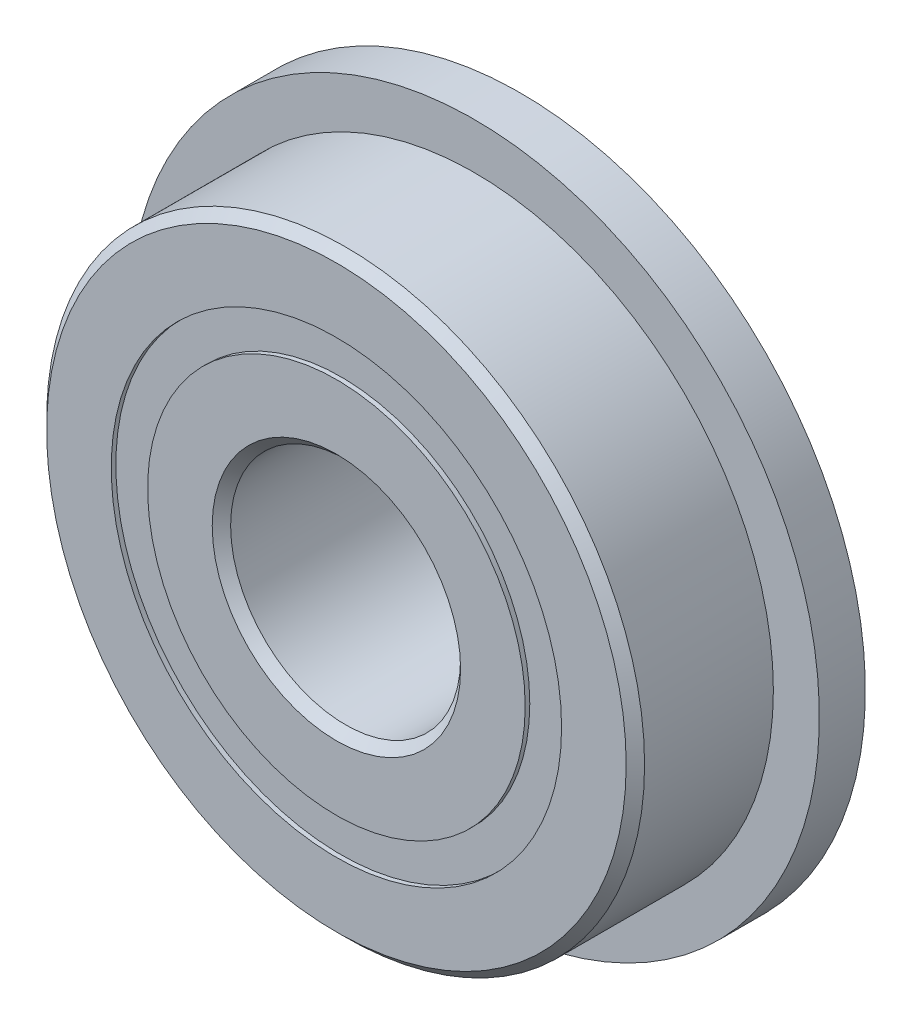
ISO-10303-21;
HEADER;
FILE_DESCRIPTION(('STEP AP214'),'2;1');
FILE_NAME('part.step','',(''),(''),'','','');
FILE_SCHEMA(('AUTOMOTIVE_DESIGN { 1 0 10303 214 1 1 1 1 }'));
ENDSEC;
DATA;
#1=APPLICATION_CONTEXT('core data for automotive mechanical design processes');
#2=APPLICATION_PROTOCOL_DEFINITION('international standard','automotive_design',2000,#1);
#3=PRODUCT_CONTEXT('',#1,'mechanical');
#4=PRODUCT('Part','Part','',(#3));
#5=PRODUCT_RELATED_PRODUCT_CATEGORY('part','',(#4));
#6=PRODUCT_DEFINITION_FORMATION('','',#4);
#7=PRODUCT_DEFINITION_CONTEXT('part definition',#1,'design');
#8=PRODUCT_DEFINITION('design','',#6,#7);
#9=PRODUCT_DEFINITION_SHAPE('','',#8);
#10=(LENGTH_UNIT() NAMED_UNIT(*) SI_UNIT(.MILLI.,.METRE.));
#11=(NAMED_UNIT(*) PLANE_ANGLE_UNIT() SI_UNIT($,.RADIAN.));
#12=(NAMED_UNIT(*) SI_UNIT($,.STERADIAN.) SOLID_ANGLE_UNIT());
#13=UNCERTAINTY_MEASURE_WITH_UNIT(LENGTH_MEASURE(1.E-05),#10,'distance_accuracy_value','');
#14=(GEOMETRIC_REPRESENTATION_CONTEXT(3) GLOBAL_UNCERTAINTY_ASSIGNED_CONTEXT((#13)) GLOBAL_UNIT_ASSIGNED_CONTEXT((#10,
#11,#12)) REPRESENTATION_CONTEXT('',''));
#15=CARTESIAN_POINT('',(0.,0.,0.));
#16=DIRECTION('',(0.,0.,1.));
#17=DIRECTION('',(1.,0.,0.));
#18=AXIS2_PLACEMENT_3D('',#15,#16,#17);
#19=CARTESIAN_POINT('',(0.,4.89560439560439,-1.9));
#20=DIRECTION('',(0.,0.,1.));
#21=DIRECTION('',(1.,0.,0.));
#22=AXIS2_PLACEMENT_3D('',#19,#20,#21);
#23=PLANE('',#22);
#24=CARTESIAN_POINT('',(0.,0.,-1.9));
#25=DIRECTION('',(0.,0.,1.));
#26=DIRECTION('',(1.,0.,0.));
#27=AXIS2_PLACEMENT_3D('',#24,#25,#26);
#28=CIRCLE('',#27,4.89560439560439);
#29=CARTESIAN_POINT('',(4.89560439560439,0.,-1.9));
#30=VERTEX_POINT('',#29);
#31=EDGE_CURVE('E55',#30,#30,#28,.T.);
#32=ORIENTED_EDGE('',*,*,#31,.F.);
#33=EDGE_LOOP('',(#32));
#34=FACE_BOUND('',#33,.T.);
#35=CARTESIAN_POINT('',(0.,0.,-1.9));
#36=DIRECTION('',(0.,0.,1.));
#37=DIRECTION('',(1.,0.,0.));
#38=AXIS2_PLACEMENT_3D('',#35,#36,#37);
#39=CIRCLE('',#38,4.1043956043956);
#40=CARTESIAN_POINT('',(4.1043956043956,0.,-1.9));
#41=VERTEX_POINT('',#40);
#42=EDGE_CURVE('E11',#41,#41,#39,.T.);
#43=ORIENTED_EDGE('',*,*,#42,.T.);
#44=EDGE_LOOP('',(#43));
#45=FACE_BOUND('',#44,.T.);
#46=ADVANCED_FACE('F41',(#34,#45),#23,.F.);
#47=CARTESIAN_POINT('',(0.,0.,2.));
#48=DIRECTION('',(0.,0.,1.));
#49=DIRECTION('',(1.,0.,0.));
#50=AXIS2_PLACEMENT_3D('',#47,#48,#49);
#51=CYLINDRICAL_SURFACE('',#50,4.1043956043956);
#52=ORIENTED_EDGE('',*,*,#42,.F.);
#53=EDGE_LOOP('',(#52));
#54=FACE_BOUND('',#53,.T.);
#55=CARTESIAN_POINT('',(0.,0.,-0.972947220876673));
#56=DIRECTION('',(0.,0.,1.));
#57=DIRECTION('',(1.,0.,0.));
#58=AXIS2_PLACEMENT_3D('',#55,#56,#57);
#59=CIRCLE('',#58,4.1043956043956);
#60=CARTESIAN_POINT('',(4.1043956043956,0.,-0.972947220876673));
#61=VERTEX_POINT('',#60);
#62=EDGE_CURVE('E47',#61,#61,#59,.T.);
#63=ORIENTED_EDGE('',*,*,#62,.T.);
#64=EDGE_LOOP('',(#63));
#65=FACE_BOUND('',#64,.T.);
#66=ADVANCED_FACE('F64',(#54,#65),#51,.F.);
#67=CARTESIAN_POINT('',(0.,4.8956043956044,-0.972947220876673));
#68=DIRECTION('',(0.,0.,-1.));
#69=DIRECTION('',(-1.,0.,0.));
#70=AXIS2_PLACEMENT_3D('',#67,#68,#69);
#71=PLANE('',#70);
#72=ORIENTED_EDGE('',*,*,#62,.F.);
#73=EDGE_LOOP('',(#72));
#74=FACE_BOUND('',#73,.T.);
#75=CARTESIAN_POINT('',(0.,0.,-0.972947220876673));
#76=DIRECTION('',(0.,0.,1.));
#77=DIRECTION('',(1.,0.,0.));
#78=AXIS2_PLACEMENT_3D('',#75,#76,#77);
#79=CIRCLE('',#78,4.8956043956044);
#80=CARTESIAN_POINT('',(4.8956043956044,0.,-0.972947220876673));
#81=VERTEX_POINT('',#80);
#82=EDGE_CURVE('E51',#81,#81,#79,.T.);
#83=ORIENTED_EDGE('',*,*,#82,.T.);
#84=EDGE_LOOP('',(#83));
#85=FACE_BOUND('',#84,.T.);
#86=ADVANCED_FACE('F68',(#74,#85),#71,.F.);
#87=CARTESIAN_POINT('',(0.,0.,2.));
#88=DIRECTION('',(0.,0.,1.));
#89=DIRECTION('',(1.,0.,0.));
#90=AXIS2_PLACEMENT_3D('',#87,#88,#89);
#91=CYLINDRICAL_SURFACE('',#90,4.89560439560439);
#92=ORIENTED_EDGE('',*,*,#82,.F.);
#93=EDGE_LOOP('',(#92));
#94=FACE_BOUND('',#93,.T.);
#95=ORIENTED_EDGE('',*,*,#31,.T.);
#96=EDGE_LOOP('',(#95));
#97=FACE_BOUND('',#96,.T.);
#98=ADVANCED_FACE('F61',(#94,#97),#91,.T.);
#99=CLOSED_SHELL('',(#46,#66,#86,#98));
#100=MANIFOLD_SOLID_BREP('B2',#99);
#101=CARTESIAN_POINT('',(0.,4.89560439560439,1.9));
#102=DIRECTION('',(0.,0.,-1.));
#103=DIRECTION('',(-1.,0.,0.));
#104=AXIS2_PLACEMENT_3D('',#101,#102,#103);
#105=PLANE('',#104);
#106=CARTESIAN_POINT('',(0.,0.,1.9));
#107=DIRECTION('',(0.,0.,1.));
#108=DIRECTION('',(1.,0.,0.));
#109=AXIS2_PLACEMENT_3D('',#106,#107,#108);
#110=CIRCLE('',#109,4.1043956043956);
#111=CARTESIAN_POINT('',(4.1043956043956,0.,1.9));
#112=VERTEX_POINT('',#111);
#113=EDGE_CURVE('E40',#112,#112,#110,.T.);
#114=ORIENTED_EDGE('',*,*,#113,.F.);
#115=EDGE_LOOP('',(#114));
#116=FACE_BOUND('',#115,.T.);
#117=CARTESIAN_POINT('',(0.,0.,1.9));
#118=DIRECTION('',(0.,0.,1.));
#119=DIRECTION('',(1.,0.,0.));
#120=AXIS2_PLACEMENT_3D('',#117,#118,#119);
#121=CIRCLE('',#120,4.89560439560439);
#122=CARTESIAN_POINT('',(4.89560439560439,0.,1.9));
#123=VERTEX_POINT('',#122);
#124=EDGE_CURVE('E122',#123,#123,#121,.T.);
#125=ORIENTED_EDGE('',*,*,#124,.T.);
#126=EDGE_LOOP('',(#125));
#127=FACE_BOUND('',#126,.T.);
#128=ADVANCED_FACE('F108',(#116,#127),#105,.F.);
#129=CARTESIAN_POINT('',(0.,0.,2.));
#130=DIRECTION('',(0.,0.,1.));
#131=DIRECTION('',(1.,0.,0.));
#132=AXIS2_PLACEMENT_3D('',#129,#130,#131);
#133=CYLINDRICAL_SURFACE('',#132,4.1043956043956);
#134=CARTESIAN_POINT('',(0.,0.,0.972947220876673));
#135=DIRECTION('',(0.,0.,1.));
#136=DIRECTION('',(1.,0.,0.));
#137=AXIS2_PLACEMENT_3D('',#134,#135,#136);
#138=CIRCLE('',#137,4.1043956043956);
#139=CARTESIAN_POINT('',(4.1043956043956,0.,0.972947220876673));
#140=VERTEX_POINT('',#139);
#141=EDGE_CURVE('E114',#140,#140,#138,.T.);
#142=ORIENTED_EDGE('',*,*,#141,.F.);
#143=EDGE_LOOP('',(#142));
#144=FACE_BOUND('',#143,.T.);
#145=ORIENTED_EDGE('',*,*,#113,.T.);
#146=EDGE_LOOP('',(#145));
#147=FACE_BOUND('',#146,.T.);
#148=ADVANCED_FACE('F137',(#144,#147),#133,.F.);
#149=CARTESIAN_POINT('',(0.,4.89560439560439,0.972947220876673));
#150=DIRECTION('',(0.,0.,1.));
#151=DIRECTION('',(1.,0.,0.));
#152=AXIS2_PLACEMENT_3D('',#149,#150,#151);
#153=PLANE('',#152);
#154=CARTESIAN_POINT('',(0.,0.,0.972947220876673));
#155=DIRECTION('',(0.,0.,1.));
#156=DIRECTION('',(1.,0.,0.));
#157=AXIS2_PLACEMENT_3D('',#154,#155,#156);
#158=CIRCLE('',#157,4.89560439560439);
#159=CARTESIAN_POINT('',(4.89560439560439,0.,0.972947220876673));
#160=VERTEX_POINT('',#159);
#161=EDGE_CURVE('E118',#160,#160,#158,.T.);
#162=ORIENTED_EDGE('',*,*,#161,.F.);
#163=EDGE_LOOP('',(#162));
#164=FACE_BOUND('',#163,.T.);
#165=ORIENTED_EDGE('',*,*,#141,.T.);
#166=EDGE_LOOP('',(#165));
#167=FACE_BOUND('',#166,.T.);
#168=ADVANCED_FACE('F132',(#164,#167),#153,.F.);
#169=CARTESIAN_POINT('',(0.,0.,2.));
#170=DIRECTION('',(0.,0.,1.));
#171=DIRECTION('',(1.,0.,0.));
#172=AXIS2_PLACEMENT_3D('',#169,#170,#171);
#173=CYLINDRICAL_SURFACE('',#172,4.89560439560439);
#174=ORIENTED_EDGE('',*,*,#124,.F.);
#175=EDGE_LOOP('',(#174));
#176=FACE_BOUND('',#175,.T.);
#177=ORIENTED_EDGE('',*,*,#161,.T.);
#178=EDGE_LOOP('',(#177));
#179=FACE_BOUND('',#178,.T.);
#180=ADVANCED_FACE('F129',(#176,#179),#173,.T.);
#181=CLOSED_SHELL('',(#128,#148,#168,#180));
#182=MANIFOLD_SOLID_BREP('B6',#181);
#183=CARTESIAN_POINT('',(-2.24999999999995,3.89711431703,0.));
#184=DIRECTION('',(0.,0.,1.));
#185=DIRECTION('',(-0.499999999999989,0.866025403784445,0.));
#186=AXIS2_PLACEMENT_3D('',#183,#184,#185);
#187=SPHERICAL_SURFACE('',#186,0.972947220876673);
#188=CARTESIAN_POINT('',(-2.24999999999995,3.89711431703,0.972947220876673));
#189=VERTEX_POINT('',#188);
#190=VERTEX_LOOP('',#189);
#191=FACE_BOUND('',#190,.T.);
#192=ADVANCED_FACE('F175',(#191),#187,.T.);
#193=CLOSED_SHELL('',(#192));
#194=MANIFOLD_SOLID_BREP('B35',#193);
#195=CARTESIAN_POINT('',(-3.89711431702995,2.25000000000005,0.));
#196=DIRECTION('',(0.,0.,1.));
#197=DIRECTION('',(-0.866025403784433,0.50000000000001,0.));
#198=AXIS2_PLACEMENT_3D('',#195,#196,#197);
#199=SPHERICAL_SURFACE('',#198,0.972947220876673);
#200=CARTESIAN_POINT('',(-3.89711431702995,2.25000000000005,0.972947220876673));
#201=VERTEX_POINT('',#200);
#202=VERTEX_LOOP('',#201);
#203=FACE_BOUND('',#202,.T.);
#204=ADVANCED_FACE('F195',(#203),#199,.T.);
#205=CLOSED_SHELL('',(#204));
#206=MANIFOLD_SOLID_BREP('B104',#205);
#207=CARTESIAN_POINT('',(-4.5,0.,0.));
#208=DIRECTION('',(0.,0.,1.));
#209=DIRECTION('',(-1.,0.,0.));
#210=AXIS2_PLACEMENT_3D('',#207,#208,#209);
#211=SPHERICAL_SURFACE('',#210,0.972947220876673);
#212=CARTESIAN_POINT('',(-4.5,0.,0.972947220876673));
#213=VERTEX_POINT('',#212);
#214=VERTEX_LOOP('',#213);
#215=FACE_BOUND('',#214,.T.);
#216=ADVANCED_FACE('F215',(#215),#211,.T.);
#217=CLOSED_SHELL('',(#216));
#218=MANIFOLD_SOLID_BREP('B171',#217);
#219=CARTESIAN_POINT('',(-3.89711431702999,-2.24999999999996,0.));
#220=DIRECTION('',(0.,0.,1.));
#221=DIRECTION('',(-0.866025403784443,-0.499999999999992,0.));
#222=AXIS2_PLACEMENT_3D('',#219,#220,#221);
#223=SPHERICAL_SURFACE('',#222,0.972947220876673);
#224=CARTESIAN_POINT('',(-3.89711431702999,-2.24999999999996,0.972947220876673));
#225=VERTEX_POINT('',#224);
#226=VERTEX_LOOP('',#225);
#227=FACE_BOUND('',#226,.T.);
#228=ADVANCED_FACE('F235',(#227),#223,.T.);
#229=CLOSED_SHELL('',(#228));
#230=MANIFOLD_SOLID_BREP('B191',#229);
#231=CARTESIAN_POINT('',(-2.25000000000003,-3.89711431702996,0.));
#232=DIRECTION('',(0.,0.,1.));
#233=DIRECTION('',(-0.500000000000007,-0.866025403784435,0.));
#234=AXIS2_PLACEMENT_3D('',#231,#232,#233);
#235=SPHERICAL_SURFACE('',#234,0.972947220876673);
#236=CARTESIAN_POINT('',(-2.25000000000003,-3.89711431702996,0.972947220876673));
#237=VERTEX_POINT('',#236);
#238=VERTEX_LOOP('',#237);
#239=FACE_BOUND('',#238,.T.);
#240=ADVANCED_FACE('F255',(#239),#235,.T.);
#241=CLOSED_SHELL('',(#240));
#242=MANIFOLD_SOLID_BREP('B211',#241);
#243=CARTESIAN_POINT('',(0.,-4.5,0.));
#244=DIRECTION('',(0.,0.,1.));
#245=DIRECTION('',(0.,-1.,0.));
#246=AXIS2_PLACEMENT_3D('',#243,#244,#245);
#247=SPHERICAL_SURFACE('',#246,0.972947220876673);
#248=CARTESIAN_POINT('',(0.,-4.5,0.972947220876673));
#249=VERTEX_POINT('',#248);
#250=VERTEX_LOOP('',#249);
#251=FACE_BOUND('',#250,.T.);
#252=ADVANCED_FACE('F275',(#251),#247,.T.);
#253=CLOSED_SHELL('',(#252));
#254=MANIFOLD_SOLID_BREP('B231',#253);
#255=CARTESIAN_POINT('',(2.24999999999998,-3.89711431702999,0.));
#256=DIRECTION('',(0.,0.,1.));
#257=DIRECTION('',(0.499999999999995,-0.866025403784442,0.));
#258=AXIS2_PLACEMENT_3D('',#255,#256,#257);
#259=SPHERICAL_SURFACE('',#258,0.972947220876673);
#260=CARTESIAN_POINT('',(2.24999999999998,-3.89711431702999,0.972947220876673));
#261=VERTEX_POINT('',#260);
#262=VERTEX_LOOP('',#261);
#263=FACE_BOUND('',#262,.T.);
#264=ADVANCED_FACE('F295',(#263),#259,.T.);
#265=CLOSED_SHELL('',(#264));
#266=MANIFOLD_SOLID_BREP('B251',#265);
#267=CARTESIAN_POINT('',(3.89711431702996,-2.25000000000002,0.));
#268=DIRECTION('',(0.,0.,1.));
#269=DIRECTION('',(0.866025403784436,-0.500000000000004,0.));
#270=AXIS2_PLACEMENT_3D('',#267,#268,#269);
#271=SPHERICAL_SURFACE('',#270,0.972947220876673);
#272=CARTESIAN_POINT('',(3.89711431702996,-2.25000000000002,0.972947220876673));
#273=VERTEX_POINT('',#272);
#274=VERTEX_LOOP('',#273);
#275=FACE_BOUND('',#274,.T.);
#276=ADVANCED_FACE('F315',(#275),#271,.T.);
#277=CLOSED_SHELL('',(#276));
#278=MANIFOLD_SOLID_BREP('B271',#277);
#279=CARTESIAN_POINT('',(4.5,0.,0.));
#280=DIRECTION('',(0.,0.,1.));
#281=DIRECTION('',(1.,0.,0.));
#282=AXIS2_PLACEMENT_3D('',#279,#280,#281);
#283=SPHERICAL_SURFACE('',#282,0.972947220876673);
#284=CARTESIAN_POINT('',(4.5,0.,0.972947220876673));
#285=VERTEX_POINT('',#284);
#286=VERTEX_LOOP('',#285);
#287=FACE_BOUND('',#286,.T.);
#288=ADVANCED_FACE('F335',(#287),#283,.T.);
#289=CLOSED_SHELL('',(#288));
#290=MANIFOLD_SOLID_BREP('B291',#289);
#291=CARTESIAN_POINT('',(3.89711431702998,2.24999999999999,0.));
#292=DIRECTION('',(0.,0.,1.));
#293=DIRECTION('',(0.86602540378444,0.499999999999998,0.));
#294=AXIS2_PLACEMENT_3D('',#291,#292,#293);
#295=SPHERICAL_SURFACE('',#294,0.972947220876673);
#296=CARTESIAN_POINT('',(3.89711431702998,2.24999999999999,0.972947220876673));
#297=VERTEX_POINT('',#296);
#298=VERTEX_LOOP('',#297);
#299=FACE_BOUND('',#298,.T.);
#300=ADVANCED_FACE('F355',(#299),#295,.T.);
#301=CLOSED_SHELL('',(#300));
#302=MANIFOLD_SOLID_BREP('B311',#301);
#303=CARTESIAN_POINT('',(2.25,3.89711431702997,0.));
#304=DIRECTION('',(0.,0.,1.));
#305=DIRECTION('',(0.500000000000001,0.866025403784438,0.));
#306=AXIS2_PLACEMENT_3D('',#303,#304,#305);
#307=SPHERICAL_SURFACE('',#306,0.972947220876673);
#308=CARTESIAN_POINT('',(2.25,3.89711431702997,0.972947220876673));
#309=VERTEX_POINT('',#308);
#310=VERTEX_LOOP('',#309);
#311=FACE_BOUND('',#310,.T.);
#312=ADVANCED_FACE('F375',(#311),#307,.T.);
#313=CLOSED_SHELL('',(#312));
#314=MANIFOLD_SOLID_BREP('B331',#313);
#315=CARTESIAN_POINT('',(0.,4.5,0.));
#316=DIRECTION('',(0.,0.,1.));
#317=DIRECTION('',(0.,1.,0.));
#318=AXIS2_PLACEMENT_3D('',#315,#316,#317);
#319=SPHERICAL_SURFACE('',#318,0.972947220876673);
#320=CARTESIAN_POINT('',(0.,4.5,0.972947220876673));
#321=VERTEX_POINT('',#320);
#322=VERTEX_LOOP('',#321);
#323=FACE_BOUND('',#322,.T.);
#324=ADVANCED_FACE('F397',(#323),#319,.T.);
#325=CLOSED_SHELL('',(#324));
#326=MANIFOLD_SOLID_BREP('B351',#325);
#327=CARTESIAN_POINT('',(0.,4.1043956043956,2.));
#328=DIRECTION('',(0.,0.,-1.));
#329=DIRECTION('',(-1.,0.,0.));
#330=AXIS2_PLACEMENT_3D('',#327,#328,#329);
#331=PLANE('',#330);
#332=CARTESIAN_POINT('',(0.,0.,2.));
#333=DIRECTION('',(0.,0.,1.));
#334=DIRECTION('',(1.,0.,0.));
#335=AXIS2_PLACEMENT_3D('',#332,#333,#334);
#336=CIRCLE('',#335,2.7);
#337=CARTESIAN_POINT('',(2.7,0.,2.));
#338=VERTEX_POINT('',#337);
#339=EDGE_CURVE('E444',#338,#338,#336,.T.);
#340=ORIENTED_EDGE('',*,*,#339,.F.);
#341=EDGE_LOOP('',(#340));
#342=FACE_BOUND('',#341,.T.);
#343=CARTESIAN_POINT('',(0.,0.,2.));
#344=DIRECTION('',(0.,0.,1.));
#345=DIRECTION('',(1.,0.,0.));
#346=AXIS2_PLACEMENT_3D('',#343,#344,#345);
#347=CIRCLE('',#346,4.1043956043956);
#348=CARTESIAN_POINT('',(4.1043956043956,0.,2.));
#349=VERTEX_POINT('',#348);
#350=EDGE_CURVE('E396',#349,#349,#347,.T.);
#351=ORIENTED_EDGE('',*,*,#350,.T.);
#352=EDGE_LOOP('',(#351));
#353=FACE_BOUND('',#352,.T.);
#354=ADVANCED_FACE('F416',(#342,#353),#331,.F.);
#355=CARTESIAN_POINT('',(0.,0.,2.));
#356=DIRECTION('',(0.,0.,1.));
#357=DIRECTION('',(1.,0.,0.));
#358=AXIS2_PLACEMENT_3D('',#355,#356,#357);
#359=CYLINDRICAL_SURFACE('',#358,4.1043956043956);
#360=ORIENTED_EDGE('',*,*,#350,.F.);
#361=EDGE_LOOP('',(#360));
#362=FACE_BOUND('',#361,.T.);
#363=CARTESIAN_POINT('',(0.,0.,0.888888888888888));
#364=DIRECTION('',(0.,0.,1.));
#365=DIRECTION('',(1.,0.,0.));
#366=AXIS2_PLACEMENT_3D('',#363,#364,#365);
#367=CIRCLE('',#366,4.1043956043956);
#368=CARTESIAN_POINT('',(4.1043956043956,0.,0.888888888888888));
#369=VERTEX_POINT('',#368);
#370=EDGE_CURVE('E422',#369,#369,#367,.T.);
#371=ORIENTED_EDGE('',*,*,#370,.T.);
#372=EDGE_LOOP('',(#371));
#373=FACE_BOUND('',#372,.T.);
#374=ADVANCED_FACE('F451',(#362,#373),#359,.T.);
#375=CARTESIAN_POINT('',(0.,0.,0.));
#376=DIRECTION('',(0.,0.,1.));
#377=DIRECTION('',(1.,0.,0.));
#378=AXIS2_PLACEMENT_3D('',#375,#376,#377);
#379=TOROIDAL_SURFACE('',#378,4.5,0.972947220876672);
#380=ORIENTED_EDGE('',*,*,#370,.F.);
#381=EDGE_LOOP('',(#380));
#382=FACE_BOUND('',#381,.T.);
#383=CARTESIAN_POINT('',(0.,0.,-0.88888888888889));
#384=DIRECTION('',(0.,0.,1.));
#385=DIRECTION('',(1.,0.,0.));
#386=AXIS2_PLACEMENT_3D('',#383,#384,#385);
#387=CIRCLE('',#386,4.1043956043956);
#388=CARTESIAN_POINT('',(4.1043956043956,0.,-0.88888888888889));
#389=VERTEX_POINT('',#388);
#390=EDGE_CURVE('E426',#389,#389,#387,.T.);
#391=ORIENTED_EDGE('',*,*,#390,.T.);
#392=EDGE_LOOP('',(#391));
#393=FACE_BOUND('',#392,.T.);
#394=ADVANCED_FACE('F455',(#382,#393),#379,.F.);
#395=CARTESIAN_POINT('',(0.,0.,2.));
#396=DIRECTION('',(0.,0.,1.));
#397=DIRECTION('',(1.,0.,0.));
#398=AXIS2_PLACEMENT_3D('',#395,#396,#397);
#399=CYLINDRICAL_SURFACE('',#398,4.1043956043956);
#400=ORIENTED_EDGE('',*,*,#390,.F.);
#401=EDGE_LOOP('',(#400));
#402=FACE_BOUND('',#401,.T.);
#403=CARTESIAN_POINT('',(0.,0.,-2.));
#404=DIRECTION('',(0.,0.,1.));
#405=DIRECTION('',(1.,0.,0.));
#406=AXIS2_PLACEMENT_3D('',#403,#404,#405);
#407=CIRCLE('',#406,4.1043956043956);
#408=CARTESIAN_POINT('',(4.1043956043956,0.,-2.));
#409=VERTEX_POINT('',#408);
#410=EDGE_CURVE('E430',#409,#409,#407,.T.);
#411=ORIENTED_EDGE('',*,*,#410,.T.);
#412=EDGE_LOOP('',(#411));
#413=FACE_BOUND('',#412,.T.);
#414=ADVANCED_FACE('F460',(#402,#413),#399,.T.);
#415=CARTESIAN_POINT('',(0.,2.7,-2.));
#416=DIRECTION('',(0.,0.,1.));
#417=DIRECTION('',(1.,0.,0.));
#418=AXIS2_PLACEMENT_3D('',#415,#416,#417);
#419=PLANE('',#418);
#420=ORIENTED_EDGE('',*,*,#410,.F.);
#421=EDGE_LOOP('',(#420));
#422=FACE_BOUND('',#421,.T.);
#423=CARTESIAN_POINT('',(0.,0.,-2.));
#424=DIRECTION('',(0.,0.,1.));
#425=DIRECTION('',(1.,0.,0.));
#426=AXIS2_PLACEMENT_3D('',#423,#424,#425);
#427=CIRCLE('',#426,2.7);
#428=CARTESIAN_POINT('',(2.7,0.,-2.));
#429=VERTEX_POINT('',#428);
#430=EDGE_CURVE('E435',#429,#429,#427,.T.);
#431=ORIENTED_EDGE('',*,*,#430,.T.);
#432=EDGE_LOOP('',(#431));
#433=FACE_BOUND('',#432,.T.);
#434=ADVANCED_FACE('F466',(#422,#433),#419,.F.);
#435=CARTESIAN_POINT('',(0.,0.,-1.8));
#436=DIRECTION('',(0.,0.,-1.));
#437=DIRECTION('',(-1.,0.,0.));
#438=AXIS2_PLACEMENT_3D('',#435,#436,#437);
#439=CONICAL_SURFACE('',#438,2.5,0.785398163397447);
#440=ORIENTED_EDGE('',*,*,#430,.F.);
#441=EDGE_LOOP('',(#440));
#442=FACE_BOUND('',#441,.T.);
#443=CARTESIAN_POINT('',(0.,0.,-1.8));
#444=DIRECTION('',(0.,0.,1.));
#445=DIRECTION('',(1.,0.,0.));
#446=AXIS2_PLACEMENT_3D('',#443,#444,#445);
#447=CIRCLE('',#446,2.5);
#448=CARTESIAN_POINT('',(2.5,0.,-1.8));
#449=VERTEX_POINT('',#448);
#450=EDGE_CURVE('E438',#449,#449,#447,.T.);
#451=ORIENTED_EDGE('',*,*,#450,.T.);
#452=EDGE_LOOP('',(#451));
#453=FACE_BOUND('',#452,.T.);
#454=ADVANCED_FACE('F470',(#442,#453),#439,.F.);
#455=CARTESIAN_POINT('',(0.,0.,2.));
#456=DIRECTION('',(0.,0.,1.));
#457=DIRECTION('',(1.,0.,0.));
#458=AXIS2_PLACEMENT_3D('',#455,#456,#457);
#459=CYLINDRICAL_SURFACE('',#458,2.5);
#460=ORIENTED_EDGE('',*,*,#450,.F.);
#461=EDGE_LOOP('',(#460));
#462=FACE_BOUND('',#461,.T.);
#463=CARTESIAN_POINT('',(0.,0.,1.8));
#464=DIRECTION('',(0.,0.,1.));
#465=DIRECTION('',(1.,0.,0.));
#466=AXIS2_PLACEMENT_3D('',#463,#464,#465);
#467=CIRCLE('',#466,2.5);
#468=CARTESIAN_POINT('',(2.5,0.,1.8));
#469=VERTEX_POINT('',#468);
#470=EDGE_CURVE('E441',#469,#469,#467,.T.);
#471=ORIENTED_EDGE('',*,*,#470,.T.);
#472=EDGE_LOOP('',(#471));
#473=FACE_BOUND('',#472,.T.);
#474=ADVANCED_FACE('F474',(#462,#473),#459,.F.);
#475=CARTESIAN_POINT('',(0.,0.,2.));
#476=DIRECTION('',(0.,0.,1.));
#477=DIRECTION('',(1.,0.,0.));
#478=AXIS2_PLACEMENT_3D('',#475,#476,#477);
#479=CONICAL_SURFACE('',#478,2.7,0.785398163397447);
#480=ORIENTED_EDGE('',*,*,#470,.F.);
#481=EDGE_LOOP('',(#480));
#482=FACE_BOUND('',#481,.T.);
#483=ORIENTED_EDGE('',*,*,#339,.T.);
#484=EDGE_LOOP('',(#483));
#485=FACE_BOUND('',#484,.T.);
#486=ADVANCED_FACE('F448',(#482,#485),#479,.F.);
#487=CLOSED_SHELL('',(#354,#374,#394,#414,#434,#454,#474,#486));
#488=MANIFOLD_SOLID_BREP('B371',#487);
#489=CARTESIAN_POINT('',(0.,0.,1.8));
#490=DIRECTION('',(0.,0.,-1.));
#491=DIRECTION('',(-1.,0.,0.));
#492=AXIS2_PLACEMENT_3D('',#489,#490,#491);
#493=CONICAL_SURFACE('',#492,6.5,0.785398163397448);
#494=CARTESIAN_POINT('',(0.,0.,2.));
#495=DIRECTION('',(0.,0.,1.));
#496=DIRECTION('',(1.,0.,0.));
#497=AXIS2_PLACEMENT_3D('',#494,#495,#496);
#498=CIRCLE('',#497,6.3);
#499=CARTESIAN_POINT('',(6.3,0.,2.));
#500=VERTEX_POINT('',#499);
#501=EDGE_CURVE('E559',#500,#500,#498,.T.);
#502=ORIENTED_EDGE('',*,*,#501,.F.);
#503=EDGE_LOOP('',(#502));
#504=FACE_BOUND('',#503,.T.);
#505=CARTESIAN_POINT('',(0.,0.,1.8));
#506=DIRECTION('',(0.,0.,1.));
#507=DIRECTION('',(1.,0.,0.));
#508=AXIS2_PLACEMENT_3D('',#505,#506,#507);
#509=CIRCLE('',#508,6.5);
#510=CARTESIAN_POINT('',(6.5,0.,1.8));
#511=VERTEX_POINT('',#510);
#512=EDGE_CURVE('E415',#511,#511,#509,.T.);
#513=ORIENTED_EDGE('',*,*,#512,.T.);
#514=EDGE_LOOP('',(#513));
#515=FACE_BOUND('',#514,.T.);
#516=ADVANCED_FACE('F537',(#504,#515),#493,.T.);
#517=CARTESIAN_POINT('',(0.,0.,2.));
#518=DIRECTION('',(0.,0.,1.));
#519=DIRECTION('',(1.,0.,0.));
#520=AXIS2_PLACEMENT_3D('',#517,#518,#519);
#521=CYLINDRICAL_SURFACE('',#520,6.5);
#522=CARTESIAN_POINT('',(0.,0.,-1.));
#523=DIRECTION('',(0.,0.,1.));
#524=DIRECTION('',(1.,0.,0.));
#525=AXIS2_PLACEMENT_3D('',#522,#523,#524);
#526=CIRCLE('',#525,6.5);
#527=CARTESIAN_POINT('',(6.5,0.,-1.));
#528=VERTEX_POINT('',#527);
#529=EDGE_CURVE('E562',#528,#528,#526,.T.);
#530=ORIENTED_EDGE('',*,*,#529,.T.);
#531=EDGE_LOOP('',(#530));
#532=FACE_BOUND('',#531,.T.);
#533=ORIENTED_EDGE('',*,*,#512,.F.);
#534=EDGE_LOOP('',(#533));
#535=FACE_BOUND('',#534,.T.);
#536=ADVANCED_FACE('F582',(#532,#535),#521,.T.);
#537=CARTESIAN_POINT('',(0.,6.3,-2.));
#538=DIRECTION('',(0.,0.,1.));
#539=DIRECTION('',(1.,0.,0.));
#540=AXIS2_PLACEMENT_3D('',#537,#538,#539);
#541=PLANE('',#540);
#542=CARTESIAN_POINT('',(0.,0.,-2.));
#543=DIRECTION('',(0.,0.,1.));
#544=DIRECTION('',(1.,0.,0.));
#545=AXIS2_PLACEMENT_3D('',#542,#543,#544);
#546=CIRCLE('',#545,4.8956043956044);
#547=CARTESIAN_POINT('',(4.8956043956044,0.,-2.));
#548=VERTEX_POINT('',#547);
#549=EDGE_CURVE('E543',#548,#548,#546,.T.);
#550=ORIENTED_EDGE('',*,*,#549,.T.);
#551=EDGE_LOOP('',(#550));
#552=FACE_BOUND('',#551,.T.);
#553=CARTESIAN_POINT('',(0.,0.,-2.));
#554=DIRECTION('',(0.,0.,-1.));
#555=DIRECTION('',(-1.,0.,0.));
#556=AXIS2_PLACEMENT_3D('',#553,#554,#555);
#557=CIRCLE('',#556,7.5);
#558=CARTESIAN_POINT('',(-7.5,0.,-2.));
#559=VERTEX_POINT('',#558);
#560=EDGE_CURVE('E565',#559,#559,#557,.T.);
#561=ORIENTED_EDGE('',*,*,#560,.T.);
#562=EDGE_LOOP('',(#561));
#563=FACE_BOUND('',#562,.T.);
#564=ADVANCED_FACE('F585',(#552,#563),#541,.F.);
#565=CARTESIAN_POINT('',(0.,0.,2.));
#566=DIRECTION('',(0.,0.,1.));
#567=DIRECTION('',(1.,0.,0.));
#568=AXIS2_PLACEMENT_3D('',#565,#566,#567);
#569=CYLINDRICAL_SURFACE('',#568,4.89560439560439);
#570=CARTESIAN_POINT('',(0.,0.,-0.888888888888889));
#571=DIRECTION('',(0.,0.,1.));
#572=DIRECTION('',(1.,0.,0.));
#573=AXIS2_PLACEMENT_3D('',#570,#571,#572);
#574=CIRCLE('',#573,4.89560439560439);
#575=CARTESIAN_POINT('',(4.89560439560439,0.,-0.888888888888889));
#576=VERTEX_POINT('',#575);
#577=EDGE_CURVE('E547',#576,#576,#574,.T.);
#578=ORIENTED_EDGE('',*,*,#577,.T.);
#579=EDGE_LOOP('',(#578));
#580=FACE_BOUND('',#579,.T.);
#581=ORIENTED_EDGE('',*,*,#549,.F.);
#582=EDGE_LOOP('',(#581));
#583=FACE_BOUND('',#582,.T.);
#584=ADVANCED_FACE('F590',(#580,#583),#569,.F.);
#585=CARTESIAN_POINT('',(0.,0.,0.));
#586=DIRECTION('',(0.,0.,1.));
#587=DIRECTION('',(1.,0.,0.));
#588=AXIS2_PLACEMENT_3D('',#585,#586,#587);
#589=TOROIDAL_SURFACE('',#588,4.5,0.972947220876673);
#590=ORIENTED_EDGE('',*,*,#577,.F.);
#591=EDGE_LOOP('',(#590));
#592=FACE_BOUND('',#591,.T.);
#593=CARTESIAN_POINT('',(0.,0.,0.888888888888888));
#594=DIRECTION('',(0.,0.,1.));
#595=DIRECTION('',(1.,0.,0.));
#596=AXIS2_PLACEMENT_3D('',#593,#594,#595);
#597=CIRCLE('',#596,4.89560439560439);
#598=CARTESIAN_POINT('',(4.89560439560439,0.,0.888888888888888));
#599=VERTEX_POINT('',#598);
#600=EDGE_CURVE('E551',#599,#599,#597,.T.);
#601=ORIENTED_EDGE('',*,*,#600,.T.);
#602=EDGE_LOOP('',(#601));
#603=FACE_BOUND('',#602,.T.);
#604=ADVANCED_FACE('F596',(#592,#603),#589,.F.);
#605=CARTESIAN_POINT('',(0.,0.,2.));
#606=DIRECTION('',(0.,0.,1.));
#607=DIRECTION('',(1.,0.,0.));
#608=AXIS2_PLACEMENT_3D('',#605,#606,#607);
#609=CYLINDRICAL_SURFACE('',#608,4.89560439560439);
#610=ORIENTED_EDGE('',*,*,#600,.F.);
#611=EDGE_LOOP('',(#610));
#612=FACE_BOUND('',#611,.T.);
#613=CARTESIAN_POINT('',(0.,0.,2.));
#614=DIRECTION('',(0.,0.,1.));
#615=DIRECTION('',(1.,0.,0.));
#616=AXIS2_PLACEMENT_3D('',#613,#614,#615);
#617=CIRCLE('',#616,4.89560439560439);
#618=CARTESIAN_POINT('',(4.89560439560439,0.,2.));
#619=VERTEX_POINT('',#618);
#620=EDGE_CURVE('E556',#619,#619,#617,.T.);
#621=ORIENTED_EDGE('',*,*,#620,.T.);
#622=EDGE_LOOP('',(#621));
#623=FACE_BOUND('',#622,.T.);
#624=ADVANCED_FACE('F600',(#612,#623),#609,.F.);
#625=CARTESIAN_POINT('',(0.,6.3,2.));
#626=DIRECTION('',(0.,0.,-1.));
#627=DIRECTION('',(-1.,0.,0.));
#628=AXIS2_PLACEMENT_3D('',#625,#626,#627);
#629=PLANE('',#628);
#630=ORIENTED_EDGE('',*,*,#620,.F.);
#631=EDGE_LOOP('',(#630));
#632=FACE_BOUND('',#631,.T.);
#633=ORIENTED_EDGE('',*,*,#501,.T.);
#634=EDGE_LOOP('',(#633));
#635=FACE_BOUND('',#634,.T.);
#636=ADVANCED_FACE('F578',(#632,#635),#629,.F.);
#637=CARTESIAN_POINT('',(0.,4.8956043956044,-1.));
#638=DIRECTION('',(0.,0.,1.));
#639=DIRECTION('',(1.,0.,0.));
#640=AXIS2_PLACEMENT_3D('',#637,#638,#639);
#641=PLANE('',#640);
#642=CARTESIAN_POINT('',(0.,0.,-1.));
#643=DIRECTION('',(0.,0.,-1.));
#644=DIRECTION('',(-1.,0.,0.));
#645=AXIS2_PLACEMENT_3D('',#642,#643,#644);
#646=CIRCLE('',#645,7.5);
#647=CARTESIAN_POINT('',(-7.5,0.,-1.));
#648=VERTEX_POINT('',#647);
#649=EDGE_CURVE('E568',#648,#648,#646,.T.);
#650=ORIENTED_EDGE('',*,*,#649,.F.);
#651=EDGE_LOOP('',(#650));
#652=FACE_BOUND('',#651,.T.);
#653=ORIENTED_EDGE('',*,*,#529,.F.);
#654=EDGE_LOOP('',(#653));
#655=FACE_BOUND('',#654,.T.);
#656=ADVANCED_FACE('F575',(#652,#655),#641,.T.);
#657=CARTESIAN_POINT('',(0.,0.,-2.));
#658=DIRECTION('',(0.,0.,-1.));
#659=DIRECTION('',(-1.,0.,0.));
#660=AXIS2_PLACEMENT_3D('',#657,#658,#659);
#661=CYLINDRICAL_SURFACE('',#660,7.5);
#662=ORIENTED_EDGE('',*,*,#649,.T.);
#663=EDGE_LOOP('',(#662));
#664=FACE_BOUND('',#663,.T.);
#665=ORIENTED_EDGE('',*,*,#560,.F.);
#666=EDGE_LOOP('',(#665));
#667=FACE_BOUND('',#666,.T.);
#668=ADVANCED_FACE('F572',(#664,#667),#661,.T.);
#669=CLOSED_SHELL('',(#516,#536,#564,#584,#604,#624,#636,#656,#668));
#670=MANIFOLD_SOLID_BREP('B391',#669);
#671=ADVANCED_BREP_SHAPE_REPRESENTATION('',(#18,#100,#182,#194,#206,#218,#230,#242,#254,#266,
#278,#290,#302,#314,#326,#488,#670),#14);
#672=SHAPE_DEFINITION_REPRESENTATION(#9,#671);
ENDSEC;
END-ISO-10303-21;
